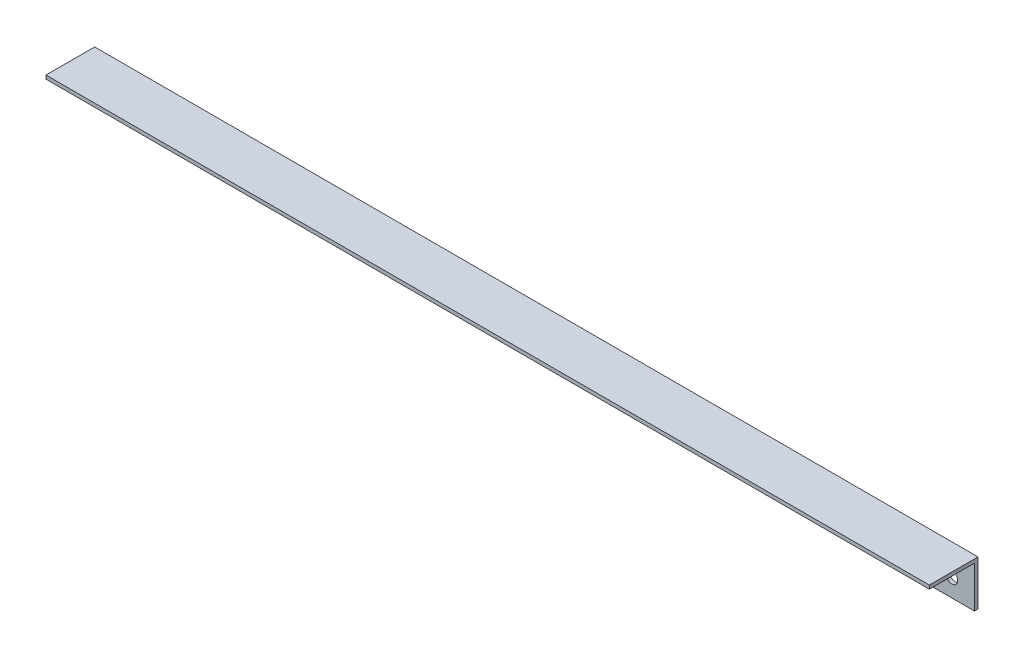
ISO-10303-21;
HEADER;
FILE_DESCRIPTION(('STEP AP214'),'2;1');
FILE_NAME('part.step','',(''),(''),'','','');
FILE_SCHEMA(('AUTOMOTIVE_DESIGN { 1 0 10303 214 1 1 1 1 }'));
ENDSEC;
DATA;
#1=APPLICATION_CONTEXT('core data for automotive mechanical design processes');
#2=APPLICATION_PROTOCOL_DEFINITION('international standard','automotive_design',2000,#1);
#3=PRODUCT_CONTEXT('',#1,'mechanical');
#4=PRODUCT('Part','Part','',(#3));
#5=PRODUCT_RELATED_PRODUCT_CATEGORY('part','',(#4));
#6=PRODUCT_DEFINITION_FORMATION('','',#4);
#7=PRODUCT_DEFINITION_CONTEXT('part definition',#1,'design');
#8=PRODUCT_DEFINITION('design','',#6,#7);
#9=PRODUCT_DEFINITION_SHAPE('','',#8);
#10=(LENGTH_UNIT() NAMED_UNIT(*) SI_UNIT(.MILLI.,.METRE.));
#11=(NAMED_UNIT(*) PLANE_ANGLE_UNIT() SI_UNIT($,.RADIAN.));
#12=(NAMED_UNIT(*) SI_UNIT($,.STERADIAN.) SOLID_ANGLE_UNIT());
#13=UNCERTAINTY_MEASURE_WITH_UNIT(LENGTH_MEASURE(1.E-05),#10,'distance_accuracy_value','');
#14=(GEOMETRIC_REPRESENTATION_CONTEXT(3) GLOBAL_UNCERTAINTY_ASSIGNED_CONTEXT((#13)) GLOBAL_UNIT_ASSIGNED_CONTEXT((#10,
#11,#12)) REPRESENTATION_CONTEXT('',''));
#15=CARTESIAN_POINT('',(0.,0.,0.));
#16=DIRECTION('',(0.,0.,1.));
#17=DIRECTION('',(1.,0.,0.));
#18=AXIS2_PLACEMENT_3D('',#15,#16,#17);
#19=CARTESIAN_POINT('',(-980.,-5.48788481732075,8.));
#20=DIRECTION('',(0.,0.,1.));
#21=DIRECTION('',(1.,0.,0.));
#22=AXIS2_PLACEMENT_3D('',#19,#20,#21);
#23=PLANE('',#22);
#24=DIRECTION('',(1.,0.,0.));
#25=VECTOR('',#24,1.);
#26=CARTESIAN_POINT('',(-980.,86.5121151826793,8.));
#27=LINE('',#26,#25);
#28=CARTESIAN_POINT('',(-980.,86.5121151826793,8.));
#29=VERTEX_POINT('',#28);
#30=CARTESIAN_POINT('',(980.,86.5121151826793,8.));
#31=VERTEX_POINT('',#30);
#32=EDGE_CURVE('E51',#29,#31,#27,.T.);
#33=ORIENTED_EDGE('',*,*,#32,.F.);
#34=DIRECTION('',(0.,-1.,0.));
#35=VECTOR('',#34,1.);
#36=CARTESIAN_POINT('',(-980.,94.5121151826794,8.));
#37=LINE('',#36,#35);
#38=CARTESIAN_POINT('',(-980.,-5.48788481732075,8.));
#39=VERTEX_POINT('',#38);
#40=EDGE_CURVE('E88',#29,#39,#37,.T.);
#41=ORIENTED_EDGE('',*,*,#40,.T.);
#42=DIRECTION('',(1.,0.,0.));
#43=VECTOR('',#42,1.);
#44=CARTESIAN_POINT('',(-980.,-5.48788481732075,8.));
#45=LINE('',#44,#43);
#46=CARTESIAN_POINT('',(980.,-5.48788481732075,8.));
#47=VERTEX_POINT('',#46);
#48=EDGE_CURVE('E57',#39,#47,#45,.T.);
#49=ORIENTED_EDGE('',*,*,#48,.T.);
#50=DIRECTION('',(0.,1.,0.));
#51=VECTOR('',#50,1.);
#52=CARTESIAN_POINT('',(980.,94.5121151826794,8.));
#53=LINE('',#52,#51);
#54=EDGE_CURVE('E99',#47,#31,#53,.T.);
#55=ORIENTED_EDGE('',*,*,#54,.T.);
#56=EDGE_LOOP('',(#33,#41,#49,#55));
#57=FACE_BOUND('',#56,.T.);
#58=CARTESIAN_POINT('',(-330.,34.5121151826793,8.));
#59=DIRECTION('',(0.,0.,1.));
#60=DIRECTION('',(-1.,0.,0.));
#61=AXIS2_PLACEMENT_3D('',#58,#59,#60);
#62=CIRCLE('',#61,13.);
#63=CARTESIAN_POINT('',(-343.,34.5121151826793,8.));
#64=VERTEX_POINT('',#63);
#65=EDGE_CURVE('E157',#64,#64,#62,.T.);
#66=ORIENTED_EDGE('',*,*,#65,.F.);
#67=EDGE_LOOP('',(#66));
#68=FACE_BOUND('',#67,.T.);
#69=CARTESIAN_POINT('',(-170.,34.5121151826792,8.));
#70=DIRECTION('',(0.,0.,1.));
#71=DIRECTION('',(-1.,0.,0.));
#72=AXIS2_PLACEMENT_3D('',#69,#70,#71);
#73=CIRCLE('',#72,13.);
#74=CARTESIAN_POINT('',(-183.,34.5121151826792,8.));
#75=VERTEX_POINT('',#74);
#76=EDGE_CURVE('E169',#75,#75,#73,.T.);
#77=ORIENTED_EDGE('',*,*,#76,.F.);
#78=EDGE_LOOP('',(#77));
#79=FACE_BOUND('',#78,.T.);
#80=CARTESIAN_POINT('',(-850.,34.5121151826793,8.));
#81=DIRECTION('',(0.,0.,1.));
#82=DIRECTION('',(-1.,0.,0.));
#83=AXIS2_PLACEMENT_3D('',#80,#81,#82);
#84=CIRCLE('',#83,13.);
#85=CARTESIAN_POINT('',(-863.,34.5121151826793,8.));
#86=VERTEX_POINT('',#85);
#87=EDGE_CURVE('E181',#86,#86,#84,.T.);
#88=ORIENTED_EDGE('',*,*,#87,.F.);
#89=EDGE_LOOP('',(#88));
#90=FACE_BOUND('',#89,.T.);
#91=CARTESIAN_POINT('',(250.,34.5121151826793,8.));
#92=DIRECTION('',(0.,0.,1.));
#93=DIRECTION('',(1.,0.,0.));
#94=AXIS2_PLACEMENT_3D('',#91,#92,#93);
#95=CIRCLE('',#94,13.);
#96=CARTESIAN_POINT('',(263.,34.5121151826793,8.));
#97=VERTEX_POINT('',#96);
#98=EDGE_CURVE('E193',#97,#97,#95,.T.);
#99=ORIENTED_EDGE('',*,*,#98,.F.);
#100=EDGE_LOOP('',(#99));
#101=FACE_BOUND('',#100,.T.);
#102=CARTESIAN_POINT('',(770.,34.5121151826793,8.));
#103=DIRECTION('',(0.,0.,1.));
#104=DIRECTION('',(1.,0.,0.));
#105=AXIS2_PLACEMENT_3D('',#102,#103,#104);
#106=CIRCLE('',#105,13.);
#107=CARTESIAN_POINT('',(783.,34.5121151826793,8.));
#108=VERTEX_POINT('',#107);
#109=EDGE_CURVE('E205',#108,#108,#106,.T.);
#110=ORIENTED_EDGE('',*,*,#109,.F.);
#111=EDGE_LOOP('',(#110));
#112=FACE_BOUND('',#111,.T.);
#113=CARTESIAN_POINT('',(930.,34.5121151826793,8.));
#114=DIRECTION('',(0.,0.,1.));
#115=DIRECTION('',(1.,0.,0.));
#116=AXIS2_PLACEMENT_3D('',#113,#114,#115);
#117=CIRCLE('',#116,13.);
#118=CARTESIAN_POINT('',(943.,34.5121151826793,8.));
#119=VERTEX_POINT('',#118);
#120=EDGE_CURVE('E104',#119,#119,#117,.T.);
#121=ORIENTED_EDGE('',*,*,#120,.F.);
#122=EDGE_LOOP('',(#121));
#123=FACE_BOUND('',#122,.T.);
#124=CARTESIAN_POINT('',(850.,34.5121151826793,8.));
#125=DIRECTION('',(0.,0.,1.));
#126=DIRECTION('',(1.,0.,0.));
#127=AXIS2_PLACEMENT_3D('',#124,#125,#126);
#128=CIRCLE('',#127,13.);
#129=CARTESIAN_POINT('',(863.,34.5121151826793,8.));
#130=VERTEX_POINT('',#129);
#131=EDGE_CURVE('E211',#130,#130,#128,.T.);
#132=ORIENTED_EDGE('',*,*,#131,.F.);
#133=EDGE_LOOP('',(#132));
#134=FACE_BOUND('',#133,.T.);
#135=CARTESIAN_POINT('',(330.,34.5121151826793,8.));
#136=DIRECTION('',(0.,0.,1.));
#137=DIRECTION('',(1.,0.,0.));
#138=AXIS2_PLACEMENT_3D('',#135,#136,#137);
#139=CIRCLE('',#138,13.);
#140=CARTESIAN_POINT('',(343.,34.5121151826793,8.));
#141=VERTEX_POINT('',#140);
#142=EDGE_CURVE('E199',#141,#141,#139,.T.);
#143=ORIENTED_EDGE('',*,*,#142,.F.);
#144=EDGE_LOOP('',(#143));
#145=FACE_BOUND('',#144,.T.);
#146=CARTESIAN_POINT('',(-770.,34.5121151826793,8.));
#147=DIRECTION('',(0.,0.,1.));
#148=DIRECTION('',(-1.,0.,0.));
#149=AXIS2_PLACEMENT_3D('',#146,#147,#148);
#150=CIRCLE('',#149,13.);
#151=CARTESIAN_POINT('',(-783.,34.5121151826793,8.));
#152=VERTEX_POINT('',#151);
#153=EDGE_CURVE('E187',#152,#152,#150,.T.);
#154=ORIENTED_EDGE('',*,*,#153,.F.);
#155=EDGE_LOOP('',(#154));
#156=FACE_BOUND('',#155,.T.);
#157=CARTESIAN_POINT('',(170.,34.5121151826792,8.));
#158=DIRECTION('',(0.,0.,1.));
#159=DIRECTION('',(1.,0.,0.));
#160=AXIS2_PLACEMENT_3D('',#157,#158,#159);
#161=CIRCLE('',#160,13.);
#162=CARTESIAN_POINT('',(183.,34.5121151826792,8.));
#163=VERTEX_POINT('',#162);
#164=EDGE_CURVE('E175',#163,#163,#161,.T.);
#165=ORIENTED_EDGE('',*,*,#164,.F.);
#166=EDGE_LOOP('',(#165));
#167=FACE_BOUND('',#166,.T.);
#168=CARTESIAN_POINT('',(-250.,34.5121151826793,8.));
#169=DIRECTION('',(0.,0.,1.));
#170=DIRECTION('',(-1.,0.,0.));
#171=AXIS2_PLACEMENT_3D('',#168,#169,#170);
#172=CIRCLE('',#171,13.);
#173=CARTESIAN_POINT('',(-263.,34.5121151826793,8.));
#174=VERTEX_POINT('',#173);
#175=EDGE_CURVE('E163',#174,#174,#172,.T.);
#176=ORIENTED_EDGE('',*,*,#175,.F.);
#177=EDGE_LOOP('',(#176));
#178=FACE_BOUND('',#177,.T.);
#179=CARTESIAN_POINT('',(-930.,34.5121151826793,8.));
#180=DIRECTION('',(0.,0.,1.));
#181=DIRECTION('',(-1.,0.,0.));
#182=AXIS2_PLACEMENT_3D('',#179,#180,#181);
#183=CIRCLE('',#182,13.);
#184=CARTESIAN_POINT('',(-943.,34.5121151826793,8.));
#185=VERTEX_POINT('',#184);
#186=EDGE_CURVE('E151',#185,#185,#183,.T.);
#187=ORIENTED_EDGE('',*,*,#186,.F.);
#188=EDGE_LOOP('',(#187));
#189=FACE_BOUND('',#188,.T.);
#190=ADVANCED_FACE('F34',(#57,#68,#79,#90,#101,#112,#123,#134,#145,#156,#167,#178,#189),#23,.T.);
#191=CARTESIAN_POINT('',(-980.,-5.48788481732075,0.));
#192=DIRECTION('',(0.,0.,1.));
#193=DIRECTION('',(1.,0.,0.));
#194=AXIS2_PLACEMENT_3D('',#191,#192,#193);
#195=PLANE('',#194);
#196=CARTESIAN_POINT('',(-330.,34.5121151826793,0.));
#197=DIRECTION('',(0.,0.,1.));
#198=DIRECTION('',(-1.,0.,0.));
#199=AXIS2_PLACEMENT_3D('',#196,#197,#198);
#200=CIRCLE('',#199,13.);
#201=CARTESIAN_POINT('',(-343.,34.5121151826793,0.));
#202=VERTEX_POINT('',#201);
#203=EDGE_CURVE('E154',#202,#202,#200,.T.);
#204=ORIENTED_EDGE('',*,*,#203,.T.);
#205=EDGE_LOOP('',(#204));
#206=FACE_BOUND('',#205,.T.);
#207=CARTESIAN_POINT('',(-170.,34.5121151826792,0.));
#208=DIRECTION('',(0.,0.,1.));
#209=DIRECTION('',(-1.,0.,0.));
#210=AXIS2_PLACEMENT_3D('',#207,#208,#209);
#211=CIRCLE('',#210,13.);
#212=CARTESIAN_POINT('',(-183.,34.5121151826792,0.));
#213=VERTEX_POINT('',#212);
#214=EDGE_CURVE('E166',#213,#213,#211,.T.);
#215=ORIENTED_EDGE('',*,*,#214,.T.);
#216=EDGE_LOOP('',(#215));
#217=FACE_BOUND('',#216,.T.);
#218=CARTESIAN_POINT('',(-850.,34.5121151826793,0.));
#219=DIRECTION('',(0.,0.,1.));
#220=DIRECTION('',(-1.,0.,0.));
#221=AXIS2_PLACEMENT_3D('',#218,#219,#220);
#222=CIRCLE('',#221,13.);
#223=CARTESIAN_POINT('',(-863.,34.5121151826793,0.));
#224=VERTEX_POINT('',#223);
#225=EDGE_CURVE('E178',#224,#224,#222,.T.);
#226=ORIENTED_EDGE('',*,*,#225,.T.);
#227=EDGE_LOOP('',(#226));
#228=FACE_BOUND('',#227,.T.);
#229=CARTESIAN_POINT('',(250.,34.5121151826793,0.));
#230=DIRECTION('',(0.,0.,1.));
#231=DIRECTION('',(1.,0.,0.));
#232=AXIS2_PLACEMENT_3D('',#229,#230,#231);
#233=CIRCLE('',#232,13.);
#234=CARTESIAN_POINT('',(263.,34.5121151826793,0.));
#235=VERTEX_POINT('',#234);
#236=EDGE_CURVE('E190',#235,#235,#233,.T.);
#237=ORIENTED_EDGE('',*,*,#236,.T.);
#238=EDGE_LOOP('',(#237));
#239=FACE_BOUND('',#238,.T.);
#240=CARTESIAN_POINT('',(770.,34.5121151826793,0.));
#241=DIRECTION('',(0.,0.,1.));
#242=DIRECTION('',(1.,0.,0.));
#243=AXIS2_PLACEMENT_3D('',#240,#241,#242);
#244=CIRCLE('',#243,13.);
#245=CARTESIAN_POINT('',(783.,34.5121151826793,0.));
#246=VERTEX_POINT('',#245);
#247=EDGE_CURVE('E202',#246,#246,#244,.T.);
#248=ORIENTED_EDGE('',*,*,#247,.T.);
#249=EDGE_LOOP('',(#248));
#250=FACE_BOUND('',#249,.T.);
#251=CARTESIAN_POINT('',(930.,34.5121151826793,0.));
#252=DIRECTION('',(0.,0.,1.));
#253=DIRECTION('',(1.,0.,0.));
#254=AXIS2_PLACEMENT_3D('',#251,#252,#253);
#255=CIRCLE('',#254,13.);
#256=CARTESIAN_POINT('',(943.,34.5121151826793,0.));
#257=VERTEX_POINT('',#256);
#258=EDGE_CURVE('E108',#257,#257,#255,.T.);
#259=ORIENTED_EDGE('',*,*,#258,.T.);
#260=EDGE_LOOP('',(#259));
#261=FACE_BOUND('',#260,.T.);
#262=DIRECTION('',(0.,-1.,0.));
#263=VECTOR('',#262,1.);
#264=CARTESIAN_POINT('',(-980.,94.5121151826794,0.));
#265=LINE('',#264,#263);
#266=CARTESIAN_POINT('',(-980.,94.5121151826794,0.));
#267=VERTEX_POINT('',#266);
#268=CARTESIAN_POINT('',(-980.,-5.48788481732075,0.));
#269=VERTEX_POINT('',#268);
#270=EDGE_CURVE('E95',#267,#269,#265,.T.);
#271=ORIENTED_EDGE('',*,*,#270,.F.);
#272=DIRECTION('',(-1.,0.,0.));
#273=VECTOR('',#272,1.);
#274=CARTESIAN_POINT('',(-980.,94.5121151826794,0.));
#275=LINE('',#274,#273);
#276=CARTESIAN_POINT('',(980.,94.5121151826794,0.));
#277=VERTEX_POINT('',#276);
#278=EDGE_CURVE('E77',#277,#267,#275,.T.);
#279=ORIENTED_EDGE('',*,*,#278,.F.);
#280=DIRECTION('',(0.,1.,0.));
#281=VECTOR('',#280,1.);
#282=CARTESIAN_POINT('',(980.,94.5121151826794,0.));
#283=LINE('',#282,#281);
#284=CARTESIAN_POINT('',(980.,-5.48788481732075,0.));
#285=VERTEX_POINT('',#284);
#286=EDGE_CURVE('E89',#285,#277,#283,.T.);
#287=ORIENTED_EDGE('',*,*,#286,.F.);
#288=DIRECTION('',(1.,0.,0.));
#289=VECTOR('',#288,1.);
#290=CARTESIAN_POINT('',(-980.,-5.48788481732075,0.));
#291=LINE('',#290,#289);
#292=EDGE_CURVE('E103',#269,#285,#291,.T.);
#293=ORIENTED_EDGE('',*,*,#292,.F.);
#294=EDGE_LOOP('',(#271,#279,#287,#293));
#295=FACE_BOUND('',#294,.T.);
#296=CARTESIAN_POINT('',(850.,34.5121151826793,0.));
#297=DIRECTION('',(0.,0.,1.));
#298=DIRECTION('',(1.,0.,0.));
#299=AXIS2_PLACEMENT_3D('',#296,#297,#298);
#300=CIRCLE('',#299,13.);
#301=CARTESIAN_POINT('',(863.,34.5121151826793,0.));
#302=VERTEX_POINT('',#301);
#303=EDGE_CURVE('E208',#302,#302,#300,.T.);
#304=ORIENTED_EDGE('',*,*,#303,.T.);
#305=EDGE_LOOP('',(#304));
#306=FACE_BOUND('',#305,.T.);
#307=CARTESIAN_POINT('',(330.,34.5121151826793,0.));
#308=DIRECTION('',(0.,0.,1.));
#309=DIRECTION('',(1.,0.,0.));
#310=AXIS2_PLACEMENT_3D('',#307,#308,#309);
#311=CIRCLE('',#310,13.);
#312=CARTESIAN_POINT('',(343.,34.5121151826793,0.));
#313=VERTEX_POINT('',#312);
#314=EDGE_CURVE('E196',#313,#313,#311,.T.);
#315=ORIENTED_EDGE('',*,*,#314,.T.);
#316=EDGE_LOOP('',(#315));
#317=FACE_BOUND('',#316,.T.);
#318=CARTESIAN_POINT('',(-770.,34.5121151826793,0.));
#319=DIRECTION('',(0.,0.,1.));
#320=DIRECTION('',(-1.,0.,0.));
#321=AXIS2_PLACEMENT_3D('',#318,#319,#320);
#322=CIRCLE('',#321,13.);
#323=CARTESIAN_POINT('',(-783.,34.5121151826793,0.));
#324=VERTEX_POINT('',#323);
#325=EDGE_CURVE('E184',#324,#324,#322,.T.);
#326=ORIENTED_EDGE('',*,*,#325,.T.);
#327=EDGE_LOOP('',(#326));
#328=FACE_BOUND('',#327,.T.);
#329=CARTESIAN_POINT('',(170.,34.5121151826792,0.));
#330=DIRECTION('',(0.,0.,1.));
#331=DIRECTION('',(1.,0.,0.));
#332=AXIS2_PLACEMENT_3D('',#329,#330,#331);
#333=CIRCLE('',#332,13.);
#334=CARTESIAN_POINT('',(183.,34.5121151826792,0.));
#335=VERTEX_POINT('',#334);
#336=EDGE_CURVE('E172',#335,#335,#333,.T.);
#337=ORIENTED_EDGE('',*,*,#336,.T.);
#338=EDGE_LOOP('',(#337));
#339=FACE_BOUND('',#338,.T.);
#340=CARTESIAN_POINT('',(-250.,34.5121151826793,0.));
#341=DIRECTION('',(0.,0.,1.));
#342=DIRECTION('',(-1.,0.,0.));
#343=AXIS2_PLACEMENT_3D('',#340,#341,#342);
#344=CIRCLE('',#343,13.);
#345=CARTESIAN_POINT('',(-263.,34.5121151826793,0.));
#346=VERTEX_POINT('',#345);
#347=EDGE_CURVE('E160',#346,#346,#344,.T.);
#348=ORIENTED_EDGE('',*,*,#347,.T.);
#349=EDGE_LOOP('',(#348));
#350=FACE_BOUND('',#349,.T.);
#351=CARTESIAN_POINT('',(-930.,34.5121151826793,0.));
#352=DIRECTION('',(0.,0.,1.));
#353=DIRECTION('',(-1.,0.,0.));
#354=AXIS2_PLACEMENT_3D('',#351,#352,#353);
#355=CIRCLE('',#354,13.);
#356=CARTESIAN_POINT('',(-943.,34.5121151826793,0.));
#357=VERTEX_POINT('',#356);
#358=EDGE_CURVE('E143',#357,#357,#355,.T.);
#359=ORIENTED_EDGE('',*,*,#358,.T.);
#360=EDGE_LOOP('',(#359));
#361=FACE_BOUND('',#360,.T.);
#362=ADVANCED_FACE('F101',(#206,#217,#228,#239,#250,#261,#295,#306,#317,#328,#339,#350,#361),
#195,.F.);
#363=CARTESIAN_POINT('',(-980.,94.5121151826794,8.));
#364=DIRECTION('',(1.,0.,0.));
#365=DIRECTION('',(0.,0.,-1.));
#366=AXIS2_PLACEMENT_3D('',#363,#364,#365);
#367=PLANE('',#366);
#368=ORIENTED_EDGE('',*,*,#270,.T.);
#369=DIRECTION('',(0.,0.,-1.));
#370=VECTOR('',#369,1.);
#371=CARTESIAN_POINT('',(-980.,-5.48788481732075,8.));
#372=LINE('',#371,#370);
#373=EDGE_CURVE('E11',#39,#269,#372,.T.);
#374=ORIENTED_EDGE('',*,*,#373,.F.);
#375=ORIENTED_EDGE('',*,*,#40,.F.);
#376=DIRECTION('',(0.,0.,-1.));
#377=VECTOR('',#376,1.);
#378=CARTESIAN_POINT('',(-980.,86.5121151826793,108.));
#379=LINE('',#378,#377);
#380=CARTESIAN_POINT('',(-980.,86.5121151826793,108.));
#381=VERTEX_POINT('',#380);
#382=EDGE_CURVE('E137',#381,#29,#379,.T.);
#383=ORIENTED_EDGE('',*,*,#382,.F.);
#384=DIRECTION('',(0.,-1.,0.));
#385=VECTOR('',#384,1.);
#386=CARTESIAN_POINT('',(-980.,94.5121151826794,108.));
#387=LINE('',#386,#385);
#388=CARTESIAN_POINT('',(-980.,94.5121151826794,108.));
#389=VERTEX_POINT('',#388);
#390=EDGE_CURVE('E98',#389,#381,#387,.T.);
#391=ORIENTED_EDGE('',*,*,#390,.F.);
#392=DIRECTION('',(0.,0.,-1.));
#393=VECTOR('',#392,1.);
#394=CARTESIAN_POINT('',(-980.,94.5121151826794,8.));
#395=LINE('',#394,#393);
#396=EDGE_CURVE('E81',#389,#267,#395,.T.);
#397=ORIENTED_EDGE('',*,*,#396,.T.);
#398=EDGE_LOOP('',(#368,#374,#375,#383,#391,#397));
#399=FACE_BOUND('',#398,.T.);
#400=ADVANCED_FACE('F36',(#399),#367,.F.);
#401=CARTESIAN_POINT('',(-980.,-5.48788481732075,8.));
#402=DIRECTION('',(0.,1.,0.));
#403=DIRECTION('',(0.,0.,1.));
#404=AXIS2_PLACEMENT_3D('',#401,#402,#403);
#405=PLANE('',#404);
#406=ORIENTED_EDGE('',*,*,#292,.T.);
#407=DIRECTION('',(0.,0.,-1.));
#408=VECTOR('',#407,1.);
#409=CARTESIAN_POINT('',(980.,-5.48788481732075,8.));
#410=LINE('',#409,#408);
#411=EDGE_CURVE('E43',#47,#285,#410,.T.);
#412=ORIENTED_EDGE('',*,*,#411,.F.);
#413=ORIENTED_EDGE('',*,*,#48,.F.);
#414=ORIENTED_EDGE('',*,*,#373,.T.);
#415=EDGE_LOOP('',(#406,#412,#413,#414));
#416=FACE_BOUND('',#415,.T.);
#417=ADVANCED_FACE('F244',(#416),#405,.F.);
#418=CARTESIAN_POINT('',(980.,94.5121151826794,8.));
#419=DIRECTION('',(-1.,0.,0.));
#420=DIRECTION('',(0.,0.,1.));
#421=AXIS2_PLACEMENT_3D('',#418,#419,#420);
#422=PLANE('',#421);
#423=ORIENTED_EDGE('',*,*,#286,.T.);
#424=DIRECTION('',(0.,0.,-1.));
#425=VECTOR('',#424,1.);
#426=CARTESIAN_POINT('',(980.,94.5121151826794,8.));
#427=LINE('',#426,#425);
#428=CARTESIAN_POINT('',(980.,94.5121151826794,108.));
#429=VERTEX_POINT('',#428);
#430=EDGE_CURVE('E84',#429,#277,#427,.T.);
#431=ORIENTED_EDGE('',*,*,#430,.F.);
#432=DIRECTION('',(0.,1.,0.));
#433=VECTOR('',#432,1.);
#434=CARTESIAN_POINT('',(980.,94.5121151826794,108.));
#435=LINE('',#434,#433);
#436=CARTESIAN_POINT('',(980.,86.5121151826793,108.));
#437=VERTEX_POINT('',#436);
#438=EDGE_CURVE('E140',#437,#429,#435,.T.);
#439=ORIENTED_EDGE('',*,*,#438,.F.);
#440=DIRECTION('',(0.,0.,-1.));
#441=VECTOR('',#440,1.);
#442=CARTESIAN_POINT('',(980.,86.5121151826793,108.));
#443=LINE('',#442,#441);
#444=EDGE_CURVE('E135',#437,#31,#443,.T.);
#445=ORIENTED_EDGE('',*,*,#444,.T.);
#446=ORIENTED_EDGE('',*,*,#54,.F.);
#447=ORIENTED_EDGE('',*,*,#411,.T.);
#448=EDGE_LOOP('',(#423,#431,#439,#445,#446,#447));
#449=FACE_BOUND('',#448,.T.);
#450=ADVANCED_FACE('F138',(#449),#422,.F.);
#451=CARTESIAN_POINT('',(-980.,94.5121151826794,8.));
#452=DIRECTION('',(0.,-1.,0.));
#453=DIRECTION('',(0.,0.,-1.));
#454=AXIS2_PLACEMENT_3D('',#451,#452,#453);
#455=PLANE('',#454);
#456=ORIENTED_EDGE('',*,*,#278,.T.);
#457=ORIENTED_EDGE('',*,*,#396,.F.);
#458=DIRECTION('',(-1.,0.,0.));
#459=VECTOR('',#458,1.);
#460=CARTESIAN_POINT('',(-980.,94.5121151826794,108.));
#461=LINE('',#460,#459);
#462=EDGE_CURVE('E141',#429,#389,#461,.T.);
#463=ORIENTED_EDGE('',*,*,#462,.F.);
#464=ORIENTED_EDGE('',*,*,#430,.T.);
#465=EDGE_LOOP('',(#456,#457,#463,#464));
#466=FACE_BOUND('',#465,.T.);
#467=ADVANCED_FACE('F79',(#466),#455,.F.);
#468=CARTESIAN_POINT('',(930.,34.5121151826793,8.));
#469=DIRECTION('',(0.,0.,-1.));
#470=DIRECTION('',(-1.,0.,0.));
#471=AXIS2_PLACEMENT_3D('',#468,#469,#470);
#472=CYLINDRICAL_SURFACE('',#471,13.);
#473=ORIENTED_EDGE('',*,*,#120,.T.);
#474=EDGE_LOOP('',(#473));
#475=FACE_BOUND('',#474,.T.);
#476=ORIENTED_EDGE('',*,*,#258,.F.);
#477=EDGE_LOOP('',(#476));
#478=FACE_BOUND('',#477,.T.);
#479=ADVANCED_FACE('F221',(#475,#478),#472,.F.);
#480=CARTESIAN_POINT('',(850.,34.5121151826793,8.));
#481=DIRECTION('',(0.,0.,-1.));
#482=DIRECTION('',(-1.,0.,0.));
#483=AXIS2_PLACEMENT_3D('',#480,#481,#482);
#484=CYLINDRICAL_SURFACE('',#483,13.);
#485=ORIENTED_EDGE('',*,*,#131,.T.);
#486=EDGE_LOOP('',(#485));
#487=FACE_BOUND('',#486,.T.);
#488=ORIENTED_EDGE('',*,*,#303,.F.);
#489=EDGE_LOOP('',(#488));
#490=FACE_BOUND('',#489,.T.);
#491=ADVANCED_FACE('F218',(#487,#490),#484,.F.);
#492=CARTESIAN_POINT('',(770.,34.5121151826793,8.));
#493=DIRECTION('',(0.,0.,-1.));
#494=DIRECTION('',(-1.,0.,0.));
#495=AXIS2_PLACEMENT_3D('',#492,#493,#494);
#496=CYLINDRICAL_SURFACE('',#495,13.);
#497=ORIENTED_EDGE('',*,*,#109,.T.);
#498=EDGE_LOOP('',(#497));
#499=FACE_BOUND('',#498,.T.);
#500=ORIENTED_EDGE('',*,*,#247,.F.);
#501=EDGE_LOOP('',(#500));
#502=FACE_BOUND('',#501,.T.);
#503=ADVANCED_FACE('F220',(#499,#502),#496,.F.);
#504=CARTESIAN_POINT('',(330.,34.5121151826793,8.));
#505=DIRECTION('',(0.,0.,-1.));
#506=DIRECTION('',(-1.,0.,0.));
#507=AXIS2_PLACEMENT_3D('',#504,#505,#506);
#508=CYLINDRICAL_SURFACE('',#507,13.);
#509=ORIENTED_EDGE('',*,*,#142,.T.);
#510=EDGE_LOOP('',(#509));
#511=FACE_BOUND('',#510,.T.);
#512=ORIENTED_EDGE('',*,*,#314,.F.);
#513=EDGE_LOOP('',(#512));
#514=FACE_BOUND('',#513,.T.);
#515=ADVANCED_FACE('F228',(#511,#514),#508,.F.);
#516=CARTESIAN_POINT('',(250.,34.5121151826793,8.));
#517=DIRECTION('',(0.,0.,-1.));
#518=DIRECTION('',(-1.,0.,0.));
#519=AXIS2_PLACEMENT_3D('',#516,#517,#518);
#520=CYLINDRICAL_SURFACE('',#519,13.);
#521=ORIENTED_EDGE('',*,*,#98,.T.);
#522=EDGE_LOOP('',(#521));
#523=FACE_BOUND('',#522,.T.);
#524=ORIENTED_EDGE('',*,*,#236,.F.);
#525=EDGE_LOOP('',(#524));
#526=FACE_BOUND('',#525,.T.);
#527=ADVANCED_FACE('F295',(#523,#526),#520,.F.);
#528=CARTESIAN_POINT('',(-770.,34.5121151826793,8.));
#529=DIRECTION('',(0.,0.,-1.));
#530=DIRECTION('',(-1.,0.,0.));
#531=AXIS2_PLACEMENT_3D('',#528,#529,#530);
#532=CYLINDRICAL_SURFACE('',#531,13.);
#533=ORIENTED_EDGE('',*,*,#153,.T.);
#534=EDGE_LOOP('',(#533));
#535=FACE_BOUND('',#534,.T.);
#536=ORIENTED_EDGE('',*,*,#325,.F.);
#537=EDGE_LOOP('',(#536));
#538=FACE_BOUND('',#537,.T.);
#539=ADVANCED_FACE('F291',(#535,#538),#532,.F.);
#540=CARTESIAN_POINT('',(-850.,34.5121151826793,8.));
#541=DIRECTION('',(0.,0.,-1.));
#542=DIRECTION('',(-1.,0.,0.));
#543=AXIS2_PLACEMENT_3D('',#540,#541,#542);
#544=CYLINDRICAL_SURFACE('',#543,13.);
#545=ORIENTED_EDGE('',*,*,#87,.T.);
#546=EDGE_LOOP('',(#545));
#547=FACE_BOUND('',#546,.T.);
#548=ORIENTED_EDGE('',*,*,#225,.F.);
#549=EDGE_LOOP('',(#548));
#550=FACE_BOUND('',#549,.T.);
#551=ADVANCED_FACE('F287',(#547,#550),#544,.F.);
#552=CARTESIAN_POINT('',(170.,34.5121151826792,8.));
#553=DIRECTION('',(0.,0.,-1.));
#554=DIRECTION('',(-1.,0.,0.));
#555=AXIS2_PLACEMENT_3D('',#552,#553,#554);
#556=CYLINDRICAL_SURFACE('',#555,13.);
#557=ORIENTED_EDGE('',*,*,#164,.T.);
#558=EDGE_LOOP('',(#557));
#559=FACE_BOUND('',#558,.T.);
#560=ORIENTED_EDGE('',*,*,#336,.F.);
#561=EDGE_LOOP('',(#560));
#562=FACE_BOUND('',#561,.T.);
#563=ADVANCED_FACE('F283',(#559,#562),#556,.F.);
#564=CARTESIAN_POINT('',(-170.,34.5121151826792,8.));
#565=DIRECTION('',(0.,0.,-1.));
#566=DIRECTION('',(-1.,0.,0.));
#567=AXIS2_PLACEMENT_3D('',#564,#565,#566);
#568=CYLINDRICAL_SURFACE('',#567,13.);
#569=ORIENTED_EDGE('',*,*,#76,.T.);
#570=EDGE_LOOP('',(#569));
#571=FACE_BOUND('',#570,.T.);
#572=ORIENTED_EDGE('',*,*,#214,.F.);
#573=EDGE_LOOP('',(#572));
#574=FACE_BOUND('',#573,.T.);
#575=ADVANCED_FACE('F279',(#571,#574),#568,.F.);
#576=CARTESIAN_POINT('',(-250.,34.5121151826793,8.));
#577=DIRECTION('',(0.,0.,-1.));
#578=DIRECTION('',(-1.,0.,0.));
#579=AXIS2_PLACEMENT_3D('',#576,#577,#578);
#580=CYLINDRICAL_SURFACE('',#579,13.);
#581=ORIENTED_EDGE('',*,*,#175,.T.);
#582=EDGE_LOOP('',(#581));
#583=FACE_BOUND('',#582,.T.);
#584=ORIENTED_EDGE('',*,*,#347,.F.);
#585=EDGE_LOOP('',(#584));
#586=FACE_BOUND('',#585,.T.);
#587=ADVANCED_FACE('F275',(#583,#586),#580,.F.);
#588=CARTESIAN_POINT('',(-330.,34.5121151826793,8.));
#589=DIRECTION('',(0.,0.,-1.));
#590=DIRECTION('',(-1.,0.,0.));
#591=AXIS2_PLACEMENT_3D('',#588,#589,#590);
#592=CYLINDRICAL_SURFACE('',#591,13.);
#593=ORIENTED_EDGE('',*,*,#65,.T.);
#594=EDGE_LOOP('',(#593));
#595=FACE_BOUND('',#594,.T.);
#596=ORIENTED_EDGE('',*,*,#203,.F.);
#597=EDGE_LOOP('',(#596));
#598=FACE_BOUND('',#597,.T.);
#599=ADVANCED_FACE('F271',(#595,#598),#592,.F.);
#600=CARTESIAN_POINT('',(-930.,34.5121151826793,8.));
#601=DIRECTION('',(0.,0.,-1.));
#602=DIRECTION('',(-1.,0.,0.));
#603=AXIS2_PLACEMENT_3D('',#600,#601,#602);
#604=CYLINDRICAL_SURFACE('',#603,13.);
#605=ORIENTED_EDGE('',*,*,#186,.T.);
#606=EDGE_LOOP('',(#605));
#607=FACE_BOUND('',#606,.T.);
#608=ORIENTED_EDGE('',*,*,#358,.F.);
#609=EDGE_LOOP('',(#608));
#610=FACE_BOUND('',#609,.T.);
#611=ADVANCED_FACE('F266',(#607,#610),#604,.F.);
#612=CARTESIAN_POINT('',(-980.,86.5121151826793,108.));
#613=DIRECTION('',(0.,1.,0.));
#614=DIRECTION('',(0.,0.,1.));
#615=AXIS2_PLACEMENT_3D('',#612,#613,#614);
#616=PLANE('',#615);
#617=ORIENTED_EDGE('',*,*,#32,.T.);
#618=ORIENTED_EDGE('',*,*,#444,.F.);
#619=DIRECTION('',(1.,0.,0.));
#620=VECTOR('',#619,1.);
#621=CARTESIAN_POINT('',(-980.,86.5121151826793,108.));
#622=LINE('',#621,#620);
#623=EDGE_CURVE('E255',#381,#437,#622,.T.);
#624=ORIENTED_EDGE('',*,*,#623,.F.);
#625=ORIENTED_EDGE('',*,*,#382,.T.);
#626=EDGE_LOOP('',(#617,#618,#624,#625));
#627=FACE_BOUND('',#626,.T.);
#628=ADVANCED_FACE('F132',(#627),#616,.F.);
#629=CARTESIAN_POINT('',(-980.,86.5121151826793,108.));
#630=DIRECTION('',(0.,0.,1.));
#631=DIRECTION('',(1.,0.,0.));
#632=AXIS2_PLACEMENT_3D('',#629,#630,#631);
#633=PLANE('',#632);
#634=ORIENTED_EDGE('',*,*,#390,.T.);
#635=ORIENTED_EDGE('',*,*,#623,.T.);
#636=ORIENTED_EDGE('',*,*,#438,.T.);
#637=ORIENTED_EDGE('',*,*,#462,.T.);
#638=EDGE_LOOP('',(#634,#635,#636,#637));
#639=FACE_BOUND('',#638,.T.);
#640=ADVANCED_FACE('F254',(#639),#633,.T.);
#641=CLOSED_SHELL('',(#190,#362,#400,#417,#450,#467,#479,#491,#503,#515,#527,#539,#551,#563,
#575,#587,#599,#611,#628,#640));
#642=MANIFOLD_SOLID_BREP('B2',#641);
#643=ADVANCED_BREP_SHAPE_REPRESENTATION('',(#18,#642),#14);
#644=SHAPE_DEFINITION_REPRESENTATION(#9,#643);
ENDSEC;
END-ISO-10303-21;
